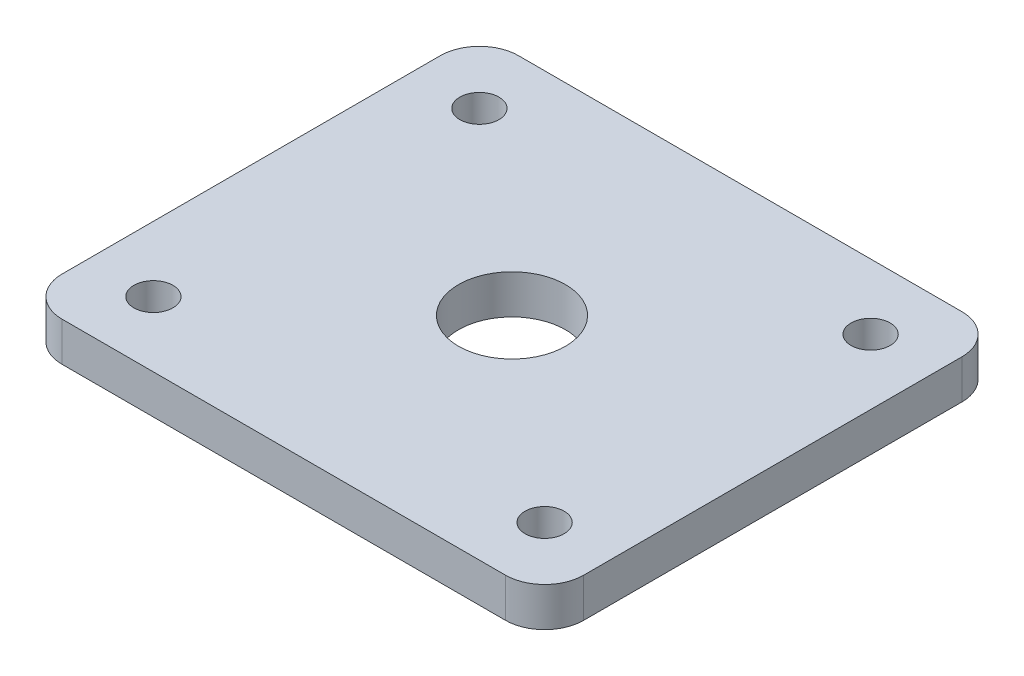
ISO-10303-21;
HEADER;
FILE_DESCRIPTION(('STEP AP214'),'2;1');
FILE_NAME('part.step','',(''),(''),'','','');
FILE_SCHEMA(('AUTOMOTIVE_DESIGN { 1 0 10303 214 1 1 1 1 }'));
ENDSEC;
DATA;
#1=APPLICATION_CONTEXT('core data for automotive mechanical design processes');
#2=APPLICATION_PROTOCOL_DEFINITION('international standard','automotive_design',2000,#1);
#3=PRODUCT_CONTEXT('',#1,'mechanical');
#4=PRODUCT('Part','Part','',(#3));
#5=PRODUCT_RELATED_PRODUCT_CATEGORY('part','',(#4));
#6=PRODUCT_DEFINITION_FORMATION('','',#4);
#7=PRODUCT_DEFINITION_CONTEXT('part definition',#1,'design');
#8=PRODUCT_DEFINITION('design','',#6,#7);
#9=PRODUCT_DEFINITION_SHAPE('','',#8);
#10=(LENGTH_UNIT() NAMED_UNIT(*) SI_UNIT(.MILLI.,.METRE.));
#11=(NAMED_UNIT(*) PLANE_ANGLE_UNIT() SI_UNIT($,.RADIAN.));
#12=(NAMED_UNIT(*) SI_UNIT($,.STERADIAN.) SOLID_ANGLE_UNIT());
#13=UNCERTAINTY_MEASURE_WITH_UNIT(LENGTH_MEASURE(1.E-05),#10,'distance_accuracy_value','');
#14=(GEOMETRIC_REPRESENTATION_CONTEXT(3) GLOBAL_UNCERTAINTY_ASSIGNED_CONTEXT((#13)) GLOBAL_UNIT_ASSIGNED_CONTEXT((#10,
#11,#12)) REPRESENTATION_CONTEXT('',''));
#15=CARTESIAN_POINT('',(0.,0.,0.));
#16=DIRECTION('',(0.,0.,1.));
#17=DIRECTION('',(1.,0.,0.));
#18=AXIS2_PLACEMENT_3D('',#15,#16,#17);
#19=CARTESIAN_POINT('',(0.,3.,-30.));
#20=DIRECTION('',(0.,0.,-1.));
#21=DIRECTION('',(-1.,0.,0.));
#22=AXIS2_PLACEMENT_3D('',#19,#20,#21);
#23=PLANE('',#22);
#24=DIRECTION('',(1.,0.,0.));
#25=VECTOR('',#24,1.);
#26=CARTESIAN_POINT('',(0.,3.,-30.));
#27=LINE('',#26,#25);
#28=CARTESIAN_POINT('',(-2.00000000000009,3.,-30.));
#29=VERTEX_POINT('',#28);
#30=CARTESIAN_POINT('',(31.9999999999999,3.,-30.));
#31=VERTEX_POINT('',#30);
#32=EDGE_CURVE('E158',#29,#31,#27,.T.);
#33=ORIENTED_EDGE('',*,*,#32,.T.);
#34=DIRECTION('',(0.,-1.,0.));
#35=VECTOR('',#34,1.);
#36=CARTESIAN_POINT('',(31.9999999999999,3.,-30.));
#37=LINE('',#36,#35);
#38=CARTESIAN_POINT('',(31.9999999999999,0.,-30.));
#39=VERTEX_POINT('',#38);
#40=EDGE_CURVE('E11',#31,#39,#37,.T.);
#41=ORIENTED_EDGE('',*,*,#40,.T.);
#42=DIRECTION('',(1.,0.,0.));
#43=VECTOR('',#42,1.);
#44=CARTESIAN_POINT('',(0.,0.,-30.));
#45=LINE('',#44,#43);
#46=CARTESIAN_POINT('',(-2.00000000000009,0.,-30.));
#47=VERTEX_POINT('',#46);
#48=EDGE_CURVE('E108',#47,#39,#45,.T.);
#49=ORIENTED_EDGE('',*,*,#48,.F.);
#50=DIRECTION('',(0.,-1.,0.));
#51=VECTOR('',#50,1.);
#52=CARTESIAN_POINT('',(-2.00000000000009,3.,-30.));
#53=LINE('',#52,#51);
#54=EDGE_CURVE('E43',#47,#29,#53,.F.);
#55=ORIENTED_EDGE('',*,*,#54,.T.);
#56=EDGE_LOOP('',(#33,#41,#49,#55));
#57=FACE_BOUND('',#56,.T.);
#58=ADVANCED_FACE('F35',(#57),#23,.T.);
#59=CARTESIAN_POINT('',(-5.00000000000009,3.,0.));
#60=DIRECTION('',(1.,0.,0.));
#61=DIRECTION('',(0.,0.,-1.));
#62=AXIS2_PLACEMENT_3D('',#59,#60,#61);
#63=PLANE('',#62);
#64=DIRECTION('',(0.,0.,1.));
#65=VECTOR('',#64,1.);
#66=CARTESIAN_POINT('',(-5.00000000000009,0.,0.));
#67=LINE('',#66,#65);
#68=CARTESIAN_POINT('',(-5.00000000000009,0.,-27.));
#69=VERTEX_POINT('',#68);
#70=CARTESIAN_POINT('',(-5.00000000000009,0.,2.));
#71=VERTEX_POINT('',#70);
#72=EDGE_CURVE('E169',#69,#71,#67,.T.);
#73=ORIENTED_EDGE('',*,*,#72,.T.);
#74=DIRECTION('',(0.,-1.,0.));
#75=VECTOR('',#74,1.);
#76=CARTESIAN_POINT('',(-5.00000000000009,3.,2.));
#77=LINE('',#76,#75);
#78=CARTESIAN_POINT('',(-5.00000000000009,3.,2.));
#79=VERTEX_POINT('',#78);
#80=EDGE_CURVE('E50',#71,#79,#77,.F.);
#81=ORIENTED_EDGE('',*,*,#80,.T.);
#82=DIRECTION('',(0.,0.,1.));
#83=VECTOR('',#82,1.);
#84=CARTESIAN_POINT('',(-5.00000000000009,3.,0.));
#85=LINE('',#84,#83);
#86=CARTESIAN_POINT('',(-5.00000000000009,3.,-27.));
#87=VERTEX_POINT('',#86);
#88=EDGE_CURVE('E163',#87,#79,#85,.T.);
#89=ORIENTED_EDGE('',*,*,#88,.F.);
#90=DIRECTION('',(0.,-1.,0.));
#91=VECTOR('',#90,1.);
#92=CARTESIAN_POINT('',(-5.00000000000009,0.,-27.));
#93=LINE('',#92,#91);
#94=EDGE_CURVE('E152',#87,#69,#93,.T.);
#95=ORIENTED_EDGE('',*,*,#94,.T.);
#96=EDGE_LOOP('',(#73,#81,#89,#95));
#97=FACE_BOUND('',#96,.T.);
#98=ADVANCED_FACE('F168',(#97),#63,.F.);
#99=CARTESIAN_POINT('',(0.,3.,5.));
#100=DIRECTION('',(0.,0.,-1.));
#101=DIRECTION('',(-1.,0.,0.));
#102=AXIS2_PLACEMENT_3D('',#99,#100,#101);
#103=PLANE('',#102);
#104=DIRECTION('',(1.,0.,0.));
#105=VECTOR('',#104,1.);
#106=CARTESIAN_POINT('',(0.,0.,5.));
#107=LINE('',#106,#105);
#108=CARTESIAN_POINT('',(-2.00000000000009,0.,5.));
#109=VERTEX_POINT('',#108);
#110=CARTESIAN_POINT('',(31.9999999999999,0.,5.));
#111=VERTEX_POINT('',#110);
#112=EDGE_CURVE('E124',#109,#111,#107,.T.);
#113=ORIENTED_EDGE('',*,*,#112,.T.);
#114=DIRECTION('',(0.,-1.,0.));
#115=VECTOR('',#114,1.);
#116=CARTESIAN_POINT('',(31.9999999999999,3.,5.));
#117=LINE('',#116,#115);
#118=CARTESIAN_POINT('',(31.9999999999999,3.,5.));
#119=VERTEX_POINT('',#118);
#120=EDGE_CURVE('E144',#111,#119,#117,.F.);
#121=ORIENTED_EDGE('',*,*,#120,.T.);
#122=DIRECTION('',(1.,0.,0.));
#123=VECTOR('',#122,1.);
#124=CARTESIAN_POINT('',(0.,3.,5.));
#125=LINE('',#124,#123);
#126=CARTESIAN_POINT('',(-2.00000000000009,3.,5.));
#127=VERTEX_POINT('',#126);
#128=EDGE_CURVE('E189',#127,#119,#125,.T.);
#129=ORIENTED_EDGE('',*,*,#128,.F.);
#130=DIRECTION('',(0.,-1.,0.));
#131=VECTOR('',#130,1.);
#132=CARTESIAN_POINT('',(-2.00000000000009,3.,5.));
#133=LINE('',#132,#131);
#134=EDGE_CURVE('E141',#127,#109,#133,.T.);
#135=ORIENTED_EDGE('',*,*,#134,.T.);
#136=EDGE_LOOP('',(#113,#121,#129,#135));
#137=FACE_BOUND('',#136,.T.);
#138=ADVANCED_FACE('F227',(#137),#103,.F.);
#139=CARTESIAN_POINT('',(34.9999999999999,3.,0.));
#140=DIRECTION('',(1.,0.,0.));
#141=DIRECTION('',(0.,0.,-1.));
#142=AXIS2_PLACEMENT_3D('',#139,#140,#141);
#143=PLANE('',#142);
#144=DIRECTION('',(0.,0.,1.));
#145=VECTOR('',#144,1.);
#146=CARTESIAN_POINT('',(34.9999999999999,3.,0.));
#147=LINE('',#146,#145);
#148=CARTESIAN_POINT('',(34.9999999999999,3.,-27.));
#149=VERTEX_POINT('',#148);
#150=CARTESIAN_POINT('',(34.9999999999999,3.,2.));
#151=VERTEX_POINT('',#150);
#152=EDGE_CURVE('E133',#149,#151,#147,.T.);
#153=ORIENTED_EDGE('',*,*,#152,.T.);
#154=DIRECTION('',(0.,-1.,0.));
#155=VECTOR('',#154,1.);
#156=CARTESIAN_POINT('',(34.9999999999999,0.,2.));
#157=LINE('',#156,#155);
#158=CARTESIAN_POINT('',(34.9999999999999,0.,2.));
#159=VERTEX_POINT('',#158);
#160=EDGE_CURVE('E122',#151,#159,#157,.T.);
#161=ORIENTED_EDGE('',*,*,#160,.T.);
#162=DIRECTION('',(0.,0.,1.));
#163=VECTOR('',#162,1.);
#164=CARTESIAN_POINT('',(34.9999999999999,0.,0.));
#165=LINE('',#164,#163);
#166=CARTESIAN_POINT('',(34.9999999999999,0.,-27.));
#167=VERTEX_POINT('',#166);
#168=EDGE_CURVE('E106',#167,#159,#165,.T.);
#169=ORIENTED_EDGE('',*,*,#168,.F.);
#170=DIRECTION('',(0.,-1.,0.));
#171=VECTOR('',#170,1.);
#172=CARTESIAN_POINT('',(34.9999999999999,3.,-27.));
#173=LINE('',#172,#171);
#174=EDGE_CURVE('E119',#167,#149,#173,.F.);
#175=ORIENTED_EDGE('',*,*,#174,.T.);
#176=EDGE_LOOP('',(#153,#161,#169,#175));
#177=FACE_BOUND('',#176,.T.);
#178=ADVANCED_FACE('F118',(#177),#143,.T.);
#179=CARTESIAN_POINT('',(0.,3.,0.));
#180=DIRECTION('',(0.,-1.,0.));
#181=DIRECTION('',(0.,0.,-1.));
#182=AXIS2_PLACEMENT_3D('',#179,#180,#181);
#183=CYLINDRICAL_SURFACE('',#182,1.5);
#184=CARTESIAN_POINT('',(0.,3.,0.));
#185=DIRECTION('',(0.,1.,0.));
#186=DIRECTION('',(0.,0.,1.));
#187=AXIS2_PLACEMENT_3D('',#184,#185,#186);
#188=CIRCLE('',#187,1.5);
#189=CARTESIAN_POINT('',(0.,3.,1.5));
#190=VERTEX_POINT('',#189);
#191=EDGE_CURVE('E164',#190,#190,#188,.T.);
#192=ORIENTED_EDGE('',*,*,#191,.T.);
#193=EDGE_LOOP('',(#192));
#194=FACE_BOUND('',#193,.T.);
#195=CARTESIAN_POINT('',(0.,0.,0.));
#196=DIRECTION('',(0.,1.,0.));
#197=DIRECTION('',(0.,0.,1.));
#198=AXIS2_PLACEMENT_3D('',#195,#196,#197);
#199=CIRCLE('',#198,1.5);
#200=CARTESIAN_POINT('',(0.,0.,1.5));
#201=VERTEX_POINT('',#200);
#202=EDGE_CURVE('E174',#201,#201,#199,.T.);
#203=ORIENTED_EDGE('',*,*,#202,.F.);
#204=EDGE_LOOP('',(#203));
#205=FACE_BOUND('',#204,.T.);
#206=ADVANCED_FACE('F231',(#194,#205),#183,.F.);
#207=CARTESIAN_POINT('',(30.,3.,0.));
#208=DIRECTION('',(0.,-1.,0.));
#209=DIRECTION('',(0.,0.,-1.));
#210=AXIS2_PLACEMENT_3D('',#207,#208,#209);
#211=CYLINDRICAL_SURFACE('',#210,1.5);
#212=CARTESIAN_POINT('',(30.,3.,0.));
#213=DIRECTION('',(0.,1.,0.));
#214=DIRECTION('',(0.,0.,1.));
#215=AXIS2_PLACEMENT_3D('',#212,#213,#214);
#216=CIRCLE('',#215,1.5);
#217=CARTESIAN_POINT('',(30.,3.,1.5));
#218=VERTEX_POINT('',#217);
#219=EDGE_CURVE('E194',#218,#218,#216,.T.);
#220=ORIENTED_EDGE('',*,*,#219,.T.);
#221=EDGE_LOOP('',(#220));
#222=FACE_BOUND('',#221,.T.);
#223=CARTESIAN_POINT('',(30.,0.,0.));
#224=DIRECTION('',(0.,1.,0.));
#225=DIRECTION('',(0.,0.,1.));
#226=AXIS2_PLACEMENT_3D('',#223,#224,#225);
#227=CIRCLE('',#226,1.5);
#228=CARTESIAN_POINT('',(30.,0.,1.5));
#229=VERTEX_POINT('',#228);
#230=EDGE_CURVE('E179',#229,#229,#227,.T.);
#231=ORIENTED_EDGE('',*,*,#230,.F.);
#232=EDGE_LOOP('',(#231));
#233=FACE_BOUND('',#232,.T.);
#234=ADVANCED_FACE('F234',(#222,#233),#211,.F.);
#235=CARTESIAN_POINT('',(29.9999999999999,3.,-25.));
#236=DIRECTION('',(0.,-1.,0.));
#237=DIRECTION('',(0.,0.,-1.));
#238=AXIS2_PLACEMENT_3D('',#235,#236,#237);
#239=CYLINDRICAL_SURFACE('',#238,1.5);
#240=CARTESIAN_POINT('',(29.9999999999999,3.,-25.));
#241=DIRECTION('',(0.,1.,0.));
#242=DIRECTION('',(0.,0.,1.));
#243=AXIS2_PLACEMENT_3D('',#240,#241,#242);
#244=CIRCLE('',#243,1.5);
#245=CARTESIAN_POINT('',(29.9999999999999,3.,-23.5));
#246=VERTEX_POINT('',#245);
#247=EDGE_CURVE('E197',#246,#246,#244,.T.);
#248=ORIENTED_EDGE('',*,*,#247,.T.);
#249=EDGE_LOOP('',(#248));
#250=FACE_BOUND('',#249,.T.);
#251=CARTESIAN_POINT('',(29.9999999999999,0.,-25.));
#252=DIRECTION('',(0.,1.,0.));
#253=DIRECTION('',(0.,0.,1.));
#254=AXIS2_PLACEMENT_3D('',#251,#252,#253);
#255=CIRCLE('',#254,1.5);
#256=CARTESIAN_POINT('',(29.9999999999999,0.,-23.5));
#257=VERTEX_POINT('',#256);
#258=EDGE_CURVE('E182',#257,#257,#255,.T.);
#259=ORIENTED_EDGE('',*,*,#258,.F.);
#260=EDGE_LOOP('',(#259));
#261=FACE_BOUND('',#260,.T.);
#262=ADVANCED_FACE('F218',(#250,#261),#239,.F.);
#263=CARTESIAN_POINT('',(0.,3.,-25.));
#264=DIRECTION('',(0.,-1.,0.));
#265=DIRECTION('',(0.,0.,-1.));
#266=AXIS2_PLACEMENT_3D('',#263,#264,#265);
#267=CYLINDRICAL_SURFACE('',#266,1.5);
#268=CARTESIAN_POINT('',(0.,3.,-25.));
#269=DIRECTION('',(0.,1.,0.));
#270=DIRECTION('',(0.,0.,1.));
#271=AXIS2_PLACEMENT_3D('',#268,#269,#270);
#272=CIRCLE('',#271,1.5);
#273=CARTESIAN_POINT('',(0.,3.,-23.5));
#274=VERTEX_POINT('',#273);
#275=EDGE_CURVE('E200',#274,#274,#272,.T.);
#276=ORIENTED_EDGE('',*,*,#275,.T.);
#277=EDGE_LOOP('',(#276));
#278=FACE_BOUND('',#277,.T.);
#279=CARTESIAN_POINT('',(0.,0.,-25.));
#280=DIRECTION('',(0.,1.,0.));
#281=DIRECTION('',(0.,0.,1.));
#282=AXIS2_PLACEMENT_3D('',#279,#280,#281);
#283=CIRCLE('',#282,1.5);
#284=CARTESIAN_POINT('',(0.,0.,-23.5));
#285=VERTEX_POINT('',#284);
#286=EDGE_CURVE('E185',#285,#285,#283,.T.);
#287=ORIENTED_EDGE('',*,*,#286,.F.);
#288=EDGE_LOOP('',(#287));
#289=FACE_BOUND('',#288,.T.);
#290=ADVANCED_FACE('F209',(#278,#289),#267,.F.);
#291=CARTESIAN_POINT('',(14.9999999999999,3.,-12.5));
#292=DIRECTION('',(0.,-1.,0.));
#293=DIRECTION('',(0.,0.,-1.));
#294=AXIS2_PLACEMENT_3D('',#291,#292,#293);
#295=CYLINDRICAL_SURFACE('',#294,4.1);
#296=CARTESIAN_POINT('',(14.9999999999999,3.,-12.5));
#297=DIRECTION('',(0.,1.,0.));
#298=DIRECTION('',(0.,0.,1.));
#299=AXIS2_PLACEMENT_3D('',#296,#297,#298);
#300=CIRCLE('',#299,4.1);
#301=CARTESIAN_POINT('',(14.9999999999999,3.,-8.4));
#302=VERTEX_POINT('',#301);
#303=EDGE_CURVE('E129',#302,#302,#300,.T.);
#304=ORIENTED_EDGE('',*,*,#303,.T.);
#305=EDGE_LOOP('',(#304));
#306=FACE_BOUND('',#305,.T.);
#307=CARTESIAN_POINT('',(14.9999999999999,0.,-12.5));
#308=DIRECTION('',(0.,1.,0.));
#309=DIRECTION('',(0.,0.,1.));
#310=AXIS2_PLACEMENT_3D('',#307,#308,#309);
#311=CIRCLE('',#310,4.1);
#312=CARTESIAN_POINT('',(14.9999999999999,0.,-8.4));
#313=VERTEX_POINT('',#312);
#314=EDGE_CURVE('E123',#313,#313,#311,.T.);
#315=ORIENTED_EDGE('',*,*,#314,.F.);
#316=EDGE_LOOP('',(#315));
#317=FACE_BOUND('',#316,.T.);
#318=ADVANCED_FACE('F207',(#306,#317),#295,.F.);
#319=CARTESIAN_POINT('',(0.,3.,0.));
#320=DIRECTION('',(0.,1.,0.));
#321=DIRECTION('',(0.,0.,1.));
#322=AXIS2_PLACEMENT_3D('',#319,#320,#321);
#323=PLANE('',#322);
#324=ORIENTED_EDGE('',*,*,#275,.F.);
#325=EDGE_LOOP('',(#324));
#326=FACE_BOUND('',#325,.T.);
#327=ORIENTED_EDGE('',*,*,#247,.F.);
#328=EDGE_LOOP('',(#327));
#329=FACE_BOUND('',#328,.T.);
#330=ORIENTED_EDGE('',*,*,#219,.F.);
#331=EDGE_LOOP('',(#330));
#332=FACE_BOUND('',#331,.T.);
#333=ORIENTED_EDGE('',*,*,#191,.F.);
#334=EDGE_LOOP('',(#333));
#335=FACE_BOUND('',#334,.T.);
#336=ORIENTED_EDGE('',*,*,#128,.T.);
#337=CARTESIAN_POINT('',(31.9999999999999,3.,2.));
#338=DIRECTION('',(0.,1.,0.));
#339=DIRECTION('',(0.,0.,1.));
#340=AXIS2_PLACEMENT_3D('',#337,#338,#339);
#341=CIRCLE('',#340,3.);
#342=EDGE_CURVE('E150',#119,#151,#341,.T.);
#343=ORIENTED_EDGE('',*,*,#342,.T.);
#344=ORIENTED_EDGE('',*,*,#152,.F.);
#345=CARTESIAN_POINT('',(31.9999999999999,3.,-27.));
#346=DIRECTION('',(0.,1.,0.));
#347=DIRECTION('',(0.,0.,1.));
#348=AXIS2_PLACEMENT_3D('',#345,#346,#347);
#349=CIRCLE('',#348,3.);
#350=EDGE_CURVE('E128',#149,#31,#349,.T.);
#351=ORIENTED_EDGE('',*,*,#350,.T.);
#352=ORIENTED_EDGE('',*,*,#32,.F.);
#353=CARTESIAN_POINT('',(-2.00000000000009,3.,-27.));
#354=DIRECTION('',(0.,1.,0.));
#355=DIRECTION('',(0.,0.,1.));
#356=AXIS2_PLACEMENT_3D('',#353,#354,#355);
#357=CIRCLE('',#356,3.);
#358=EDGE_CURVE('E57',#29,#87,#357,.T.);
#359=ORIENTED_EDGE('',*,*,#358,.T.);
#360=ORIENTED_EDGE('',*,*,#88,.T.);
#361=CARTESIAN_POINT('',(-2.00000000000009,3.,2.));
#362=DIRECTION('',(0.,1.,0.));
#363=DIRECTION('',(0.,0.,1.));
#364=AXIS2_PLACEMENT_3D('',#361,#362,#363);
#365=CIRCLE('',#364,3.);
#366=EDGE_CURVE('E148',#79,#127,#365,.T.);
#367=ORIENTED_EDGE('',*,*,#366,.T.);
#368=EDGE_LOOP('',(#336,#343,#344,#351,#352,#359,#360,#367));
#369=FACE_BOUND('',#368,.T.);
#370=ORIENTED_EDGE('',*,*,#303,.F.);
#371=EDGE_LOOP('',(#370));
#372=FACE_BOUND('',#371,.T.);
#373=ADVANCED_FACE('F161',(#326,#329,#332,#335,#369,#372),#323,.T.);
#374=CARTESIAN_POINT('',(0.,0.,0.));
#375=DIRECTION('',(0.,1.,0.));
#376=DIRECTION('',(0.,0.,1.));
#377=AXIS2_PLACEMENT_3D('',#374,#375,#376);
#378=PLANE('',#377);
#379=ORIENTED_EDGE('',*,*,#286,.T.);
#380=EDGE_LOOP('',(#379));
#381=FACE_BOUND('',#380,.T.);
#382=ORIENTED_EDGE('',*,*,#258,.T.);
#383=EDGE_LOOP('',(#382));
#384=FACE_BOUND('',#383,.T.);
#385=ORIENTED_EDGE('',*,*,#230,.T.);
#386=EDGE_LOOP('',(#385));
#387=FACE_BOUND('',#386,.T.);
#388=ORIENTED_EDGE('',*,*,#202,.T.);
#389=EDGE_LOOP('',(#388));
#390=FACE_BOUND('',#389,.T.);
#391=ORIENTED_EDGE('',*,*,#168,.T.);
#392=CARTESIAN_POINT('',(31.9999999999999,0.,2.));
#393=DIRECTION('',(0.,1.,0.));
#394=DIRECTION('',(0.,0.,1.));
#395=AXIS2_PLACEMENT_3D('',#392,#393,#394);
#396=CIRCLE('',#395,3.);
#397=EDGE_CURVE('E139',#159,#111,#396,.F.);
#398=ORIENTED_EDGE('',*,*,#397,.T.);
#399=ORIENTED_EDGE('',*,*,#112,.F.);
#400=CARTESIAN_POINT('',(-2.00000000000009,0.,2.));
#401=DIRECTION('',(0.,1.,0.));
#402=DIRECTION('',(0.,0.,1.));
#403=AXIS2_PLACEMENT_3D('',#400,#401,#402);
#404=CIRCLE('',#403,3.);
#405=EDGE_CURVE('E112',#109,#71,#404,.F.);
#406=ORIENTED_EDGE('',*,*,#405,.T.);
#407=ORIENTED_EDGE('',*,*,#72,.F.);
#408=CARTESIAN_POINT('',(-2.00000000000009,0.,-27.));
#409=DIRECTION('',(0.,1.,0.));
#410=DIRECTION('',(0.,0.,1.));
#411=AXIS2_PLACEMENT_3D('',#408,#409,#410);
#412=CIRCLE('',#411,3.);
#413=EDGE_CURVE('E113',#69,#47,#412,.F.);
#414=ORIENTED_EDGE('',*,*,#413,.T.);
#415=ORIENTED_EDGE('',*,*,#48,.T.);
#416=CARTESIAN_POINT('',(31.9999999999999,0.,-27.));
#417=DIRECTION('',(0.,1.,0.));
#418=DIRECTION('',(0.,0.,1.));
#419=AXIS2_PLACEMENT_3D('',#416,#417,#418);
#420=CIRCLE('',#419,3.);
#421=EDGE_CURVE('E102',#39,#167,#420,.F.);
#422=ORIENTED_EDGE('',*,*,#421,.T.);
#423=EDGE_LOOP('',(#391,#398,#399,#406,#407,#414,#415,#422));
#424=FACE_BOUND('',#423,.T.);
#425=ORIENTED_EDGE('',*,*,#314,.T.);
#426=EDGE_LOOP('',(#425));
#427=FACE_BOUND('',#426,.T.);
#428=ADVANCED_FACE('F104',(#381,#384,#387,#390,#424,#427),#378,.F.);
#429=CARTESIAN_POINT('',(31.9999999999999,3.,2.));
#430=DIRECTION('',(0.,1.,0.));
#431=DIRECTION('',(0.,0.,1.));
#432=AXIS2_PLACEMENT_3D('',#429,#430,#431);
#433=CYLINDRICAL_SURFACE('',#432,3.);
#434=ORIENTED_EDGE('',*,*,#342,.F.);
#435=ORIENTED_EDGE('',*,*,#120,.F.);
#436=ORIENTED_EDGE('',*,*,#397,.F.);
#437=ORIENTED_EDGE('',*,*,#160,.F.);
#438=EDGE_LOOP('',(#434,#435,#436,#437));
#439=FACE_BOUND('',#438,.T.);
#440=ADVANCED_FACE('F242',(#439),#433,.T.);
#441=CARTESIAN_POINT('',(-2.00000000000009,3.,2.));
#442=DIRECTION('',(0.,-1.,0.));
#443=DIRECTION('',(0.,0.,-1.));
#444=AXIS2_PLACEMENT_3D('',#441,#442,#443);
#445=CYLINDRICAL_SURFACE('',#444,3.);
#446=ORIENTED_EDGE('',*,*,#366,.F.);
#447=ORIENTED_EDGE('',*,*,#80,.F.);
#448=ORIENTED_EDGE('',*,*,#405,.F.);
#449=ORIENTED_EDGE('',*,*,#134,.F.);
#450=EDGE_LOOP('',(#446,#447,#448,#449));
#451=FACE_BOUND('',#450,.T.);
#452=ADVANCED_FACE('F245',(#451),#445,.T.);
#453=CARTESIAN_POINT('',(31.9999999999999,3.,-27.));
#454=DIRECTION('',(0.,-1.,0.));
#455=DIRECTION('',(0.,0.,-1.));
#456=AXIS2_PLACEMENT_3D('',#453,#454,#455);
#457=CYLINDRICAL_SURFACE('',#456,3.);
#458=ORIENTED_EDGE('',*,*,#350,.F.);
#459=ORIENTED_EDGE('',*,*,#174,.F.);
#460=ORIENTED_EDGE('',*,*,#421,.F.);
#461=ORIENTED_EDGE('',*,*,#40,.F.);
#462=EDGE_LOOP('',(#458,#459,#460,#461));
#463=FACE_BOUND('',#462,.T.);
#464=ADVANCED_FACE('F127',(#463),#457,.T.);
#465=CARTESIAN_POINT('',(-2.00000000000009,3.,-27.));
#466=DIRECTION('',(0.,1.,0.));
#467=DIRECTION('',(0.,0.,1.));
#468=AXIS2_PLACEMENT_3D('',#465,#466,#467);
#469=CYLINDRICAL_SURFACE('',#468,3.);
#470=ORIENTED_EDGE('',*,*,#358,.F.);
#471=ORIENTED_EDGE('',*,*,#54,.F.);
#472=ORIENTED_EDGE('',*,*,#413,.F.);
#473=ORIENTED_EDGE('',*,*,#94,.F.);
#474=EDGE_LOOP('',(#470,#471,#472,#473));
#475=FACE_BOUND('',#474,.T.);
#476=ADVANCED_FACE('F37',(#475),#469,.T.);
#477=CLOSED_SHELL('',(#58,#98,#138,#178,#206,#234,#262,#290,#318,#373,#428,#440,#452,#464,#476));
#478=MANIFOLD_SOLID_BREP('B2',#477);
#479=ADVANCED_BREP_SHAPE_REPRESENTATION('',(#18,#478),#14);
#480=SHAPE_DEFINITION_REPRESENTATION(#9,#479);
ENDSEC;
END-ISO-10303-21;
